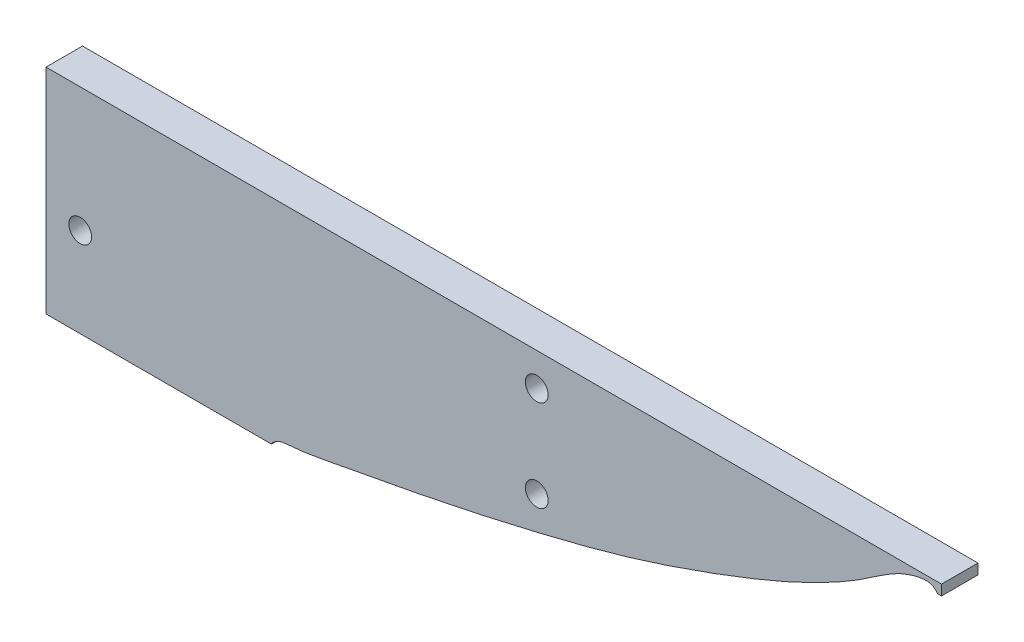
ISO-10303-21;
HEADER;
FILE_DESCRIPTION(('STEP AP214'),'2;1');
FILE_NAME('part.step','',(''),(''),'','','');
FILE_SCHEMA(('AUTOMOTIVE_DESIGN { 1 0 10303 214 1 1 1 1 }'));
ENDSEC;
DATA;
#1=APPLICATION_CONTEXT('core data for automotive mechanical design processes');
#2=APPLICATION_PROTOCOL_DEFINITION('international standard','automotive_design',2000,#1);
#3=PRODUCT_CONTEXT('',#1,'mechanical');
#4=PRODUCT('Part','Part','',(#3));
#5=PRODUCT_RELATED_PRODUCT_CATEGORY('part','',(#4));
#6=PRODUCT_DEFINITION_FORMATION('','',#4);
#7=PRODUCT_DEFINITION_CONTEXT('part definition',#1,'design');
#8=PRODUCT_DEFINITION('design','',#6,#7);
#9=PRODUCT_DEFINITION_SHAPE('','',#8);
#10=(LENGTH_UNIT() NAMED_UNIT(*) SI_UNIT(.MILLI.,.METRE.));
#11=(NAMED_UNIT(*) PLANE_ANGLE_UNIT() SI_UNIT($,.RADIAN.));
#12=(NAMED_UNIT(*) SI_UNIT($,.STERADIAN.) SOLID_ANGLE_UNIT());
#13=UNCERTAINTY_MEASURE_WITH_UNIT(LENGTH_MEASURE(1.E-05),#10,'distance_accuracy_value','');
#14=(GEOMETRIC_REPRESENTATION_CONTEXT(3) GLOBAL_UNCERTAINTY_ASSIGNED_CONTEXT((#13)) GLOBAL_UNIT_ASSIGNED_CONTEXT((#10,
#11,#12)) REPRESENTATION_CONTEXT('',''));
#15=CARTESIAN_POINT('',(0.,0.,0.));
#16=DIRECTION('',(0.,0.,1.));
#17=DIRECTION('',(1.,0.,0.));
#18=AXIS2_PLACEMENT_3D('',#15,#16,#17);
#19=CARTESIAN_POINT('',(-82.7876633942159,-44.6088772836882,284.));
#20=DIRECTION('',(0.,0.,-1.));
#21=DIRECTION('',(-1.,0.,0.));
#22=AXIS2_PLACEMENT_3D('',#19,#20,#21);
#23=PLANE('',#22);
#24=CARTESIAN_POINT('',(0.0705666698621599,-25.,284.));
#25=DIRECTION('',(0.,0.,-1.));
#26=DIRECTION('',(-1.,0.,0.));
#27=AXIS2_PLACEMENT_3D('',#24,#25,#26);
#28=CIRCLE('',#27,2.5);
#29=CARTESIAN_POINT('',(-2.42943333013784,-25.,284.));
#30=VERTEX_POINT('',#29);
#31=EDGE_CURVE('E203',#30,#30,#28,.F.);
#32=ORIENTED_EDGE('',*,*,#31,.F.);
#33=EDGE_LOOP('',(#32));
#34=FACE_BOUND('',#33,.T.);
#35=CARTESIAN_POINT('',(-58.0795296177127,-44.6040399462207,284.));
#36=CARTESIAN_POINT('',(-74.5516186288167,-44.6079999232781,284.));
#37=CARTESIAN_POINT('',(-91.0237080512297,-44.610448965777,284.));
#38=CARTESIAN_POINT('',(-107.495797495875,-44.6116316561197,284.));
#39=B_SPLINE_CURVE_WITH_KNOTS('',3,(#35,#36,#37,#38),.UNSPECIFIED.,.F.,.F.,(4,4),(0.,1.),.UNSPECIFIED.);
#40=CARTESIAN_POINT('',(-107.495797495875,-44.6116316561197,284.));
#41=VERTEX_POINT('',#40);
#42=CARTESIAN_POINT('',(-58.0795296177127,-44.6040399462207,284.));
#43=VERTEX_POINT('',#42);
#44=EDGE_CURVE('E161',#41,#43,#39,.F.);
#45=ORIENTED_EDGE('',*,*,#44,.T.);
#46=CARTESIAN_POINT('',(87.9000017033141,0.,284.));
#47=CARTESIAN_POINT('',(87.8653396456168,0.0980420146057537,284.));
#48=CARTESIAN_POINT('',(87.8013360951465,0.180749488858223,284.));
#49=CARTESIAN_POINT('',(87.6539385927667,0.325247470205002,284.));
#50=CARTESIAN_POINT('',(87.5738090656199,0.389702497273984,284.));
#51=CARTESIAN_POINT('',(87.3342367163133,0.58405683445658,284.));
#52=CARTESIAN_POINT('',(87.1783876782537,0.718628240588058,284.));
#53=CARTESIAN_POINT('',(86.8410216039408,0.955370913939716,284.));
#54=CARTESIAN_POINT('',(86.6635800893692,1.0560221129167,284.));
#55=CARTESIAN_POINT('',(86.37285087761,1.15729511730315,284.));
#56=CARTESIAN_POINT('',(86.2720949676005,1.18393050256648,284.));
#57=CARTESIAN_POINT('',(86.0710092920115,1.22407658913271,284.));
#58=CARTESIAN_POINT('',(85.9698567197867,1.23794936499142,284.));
#59=CARTESIAN_POINT('',(85.6650858045129,1.26621403875901,284.));
#60=CARTESIAN_POINT('',(85.4596028389862,1.2677819749991,284.));
#61=CARTESIAN_POINT('',(85.0494430044638,1.2517369480443,284.));
#62=CARTESIAN_POINT('',(84.8461201501977,1.2350187843396,284.));
#63=CARTESIAN_POINT('',(84.2405113190443,1.16328811663435,284.));
#64=CARTESIAN_POINT('',(83.8427672151223,1.08579802429941,284.));
#65=CARTESIAN_POINT('',(82.6580341722722,0.811265129231248,284.));
#66=CARTESIAN_POINT('',(81.8756082493053,0.568779857606499,284.));
#67=CARTESIAN_POINT('',(80.3572605425836,0.00398704805900235,284.));
#68=CARTESIAN_POINT('',(79.6206391362531,-0.32050268834254,284.));
#69=CARTESIAN_POINT('',(77.4768003054753,-1.41720591105438,284.));
#70=CARTESIAN_POINT('',(76.1325248617917,-2.30689834171348,284.));
#71=CARTESIAN_POINT('',(74.1320080138409,-3.67110689298696,284.));
#72=CARTESIAN_POINT('',(73.4673471342155,-4.1298059051442,284.));
#73=CARTESIAN_POINT('',(72.1290993022945,-5.03135336637141,284.));
#74=CARTESIAN_POINT('',(71.4565589382907,-5.47610171556373,284.));
#75=CARTESIAN_POINT('',(69.4198716178133,-6.7767208167424,284.));
#76=CARTESIAN_POINT('',(68.0357367118317,-7.59734003904331,284.));
#77=CARTESIAN_POINT('',(65.231360643593,-9.17490007759232,284.));
#78=CARTESIAN_POINT('',(63.8115567286702,-9.93261204034462,284.));
#79=CARTESIAN_POINT('',(60.9462699024224,-11.4027474832257,284.));
#80=CARTESIAN_POINT('',(59.5004015377221,-12.1144911627031,284.));
#81=CARTESIAN_POINT('',(56.581315867318,-13.4897448594068,284.));
#82=CARTESIAN_POINT('',(55.1100377877348,-14.1533176349048,284.));
#83=CARTESIAN_POINT('',(50.6733914171074,-16.0873618570717,284.));
#84=CARTESIAN_POINT('',(47.6835129425326,-17.304210263155,284.));
#85=CARTESIAN_POINT('',(41.6704256877051,-19.6485592866037,284.));
#86=CARTESIAN_POINT('',(38.6453984391489,-20.7746726471934,284.));
#87=CARTESIAN_POINT('',(32.5689267201794,-22.9464414317067,284.));
#88=CARTESIAN_POINT('',(29.5175776769437,-23.9935782128785,284.));
#89=CARTESIAN_POINT('',(23.3808508667117,-25.9873016892159,284.));
#90=CARTESIAN_POINT('',(20.293107036825,-26.9303385518061,284.));
#91=CARTESIAN_POINT('',(14.0887992538718,-28.7050622369073,284.));
#92=CARTESIAN_POINT('',(10.9718411628047,-29.5372724999855,284.));
#93=CARTESIAN_POINT('',(4.71872414116276,-31.1301622000698,284.));
#94=CARTESIAN_POINT('',(1.58334207512824,-31.8947761325704,284.));
#95=CARTESIAN_POINT('',(-4.69597160889511,-33.3844274222877,284.));
#96=CARTESIAN_POINT('',(-7.84053695370099,-34.1077207871548,284.));
#97=CARTESIAN_POINT('',(-14.1409776624989,-35.5046935082924,284.));
#98=CARTESIAN_POINT('',(-17.2974993980452,-36.1763651395498,284.));
#99=CARTESIAN_POINT('',(-23.6206088278389,-37.469490396936,284.));
#100=CARTESIAN_POINT('',(-26.7870806280639,-38.0920825005276,284.));
#101=CARTESIAN_POINT('',(-33.1254643418734,-39.3088099977398,284.));
#102=CARTESIAN_POINT('',(-36.2966345350404,-39.9068481571162,284.));
#103=CARTESIAN_POINT('',(-41.0542778663929,-40.7990932571252,284.));
#104=CARTESIAN_POINT('',(-42.6403540163524,-41.0954731164181,284.));
#105=CARTESIAN_POINT('',(-45.0207896763988,-41.5328228684628,284.));
#106=CARTESIAN_POINT('',(-45.814490562067,-41.6773941740286,284.));
#107=CARTESIAN_POINT('',(-47.4022620668679,-41.9645213486842,284.));
#108=CARTESIAN_POINT('',(-48.1960149436946,-42.109368534003,284.));
#109=CARTESIAN_POINT('',(-49.7858847036802,-42.3830667315219,284.));
#110=CARTESIAN_POINT('',(-50.5823502077406,-42.5093769811104,284.));
#111=CARTESIAN_POINT('',(-51.7824329729814,-42.661768242393,284.));
#112=CARTESIAN_POINT('',(-52.1833244113323,-42.7066174390891,284.));
#113=CARTESIAN_POINT('',(-52.9869873438325,-42.7833710311323,284.));
#114=CARTESIAN_POINT('',(-53.3897815505694,-42.8126686266408,284.));
#115=CARTESIAN_POINT('',(-54.1956202808017,-42.8686694744698,284.));
#116=CARTESIAN_POINT('',(-54.5983619798629,-42.8983799966415,284.));
#117=CARTESIAN_POINT('',(-55.1995254941832,-42.9713312718108,284.));
#118=CARTESIAN_POINT('',(-55.3994368528231,-43.0002346459609,284.));
#119=CARTESIAN_POINT('',(-55.7976837032305,-43.0732096670732,284.));
#120=CARTESIAN_POINT('',(-55.9963423349914,-43.1178965510267,284.));
#121=CARTESIAN_POINT('',(-56.3824699494814,-43.23302603243,284.));
#122=CARTESIAN_POINT('',(-56.5706730400703,-43.3035754110954,284.));
#123=CARTESIAN_POINT('',(-56.9324580496833,-43.4837323223588,284.));
#124=CARTESIAN_POINT('',(-57.1047980914133,-43.5967124128002,284.));
#125=CARTESIAN_POINT('',(-57.4252865505525,-43.8442018881937,284.));
#126=CARTESIAN_POINT('',(-57.5745982079202,-43.9810078632689,284.));
#127=CARTESIAN_POINT('',(-57.7960560746601,-44.1892150895068,284.));
#128=CARTESIAN_POINT('',(-57.8693222732054,-44.2605899168848,284.));
#129=CARTESIAN_POINT('',(-57.9666950528076,-44.3777989701655,284.));
#130=CARTESIAN_POINT('',(-57.9965401336716,-44.4186921055329,284.));
#131=CARTESIAN_POINT('',(-58.0467868509809,-44.5070696016433,284.));
#132=CARTESIAN_POINT('',(-58.0670133466572,-44.5549883260214,284.));
#133=CARTESIAN_POINT('',(-58.0795296177127,-44.6040399462207,284.));
#134=B_SPLINE_CURVE_WITH_KNOTS('',3,(#46,#47,#48,#49,#50,#51,#52,#53,#54,#55,#56,#57,#58,#59,
#60,#61,#62,#63,#64,#65,#66,#67,#68,#69,#70,#71,#72,#73,#74,#75,#76,#77,#78,#79,#80,#81,#82,#83,
#84,#85,#86,#87,#88,#89,#90,#91,#92,#93,#94,#95,#96,#97,#98,#99,#100,#101,#102,#103,#104,#105,
#106,#107,#108,#109,#110,#111,#112,#113,#114,#115,#116,#117,#118,#119,#120,#121,#122,#123,#124,
#125,#126,#127,#128,#129,#130,#131,#132,#133),.UNSPECIFIED.,.F.,.F.,(4,2,2,2,2,2,2,2,2,2,2,2,2,
2,2,2,2,2,2,2,2,2,2,2,2,2,2,2,2,2,2,2,2,2,2,2,2,2,2,2,2,2,2,4),(0.,0.00195312499999989,
0.00390624999999967,0.00781249999999911,0.0117187499999986,0.0136718749999984,
0.0156249999999983,0.0195312499999983,0.0234374999999982,0.0312499999999982,0.0468749999999981,
0.0624999999999981,0.0937499999999979,0.109374999999998,0.124999999999998,0.156249999999998,
0.187499999999998,0.218749999999998,0.249999999999998,0.312499999999998,0.374999999999998,
0.437499999999999,0.499999999999999,0.562499999999999,0.624999999999999,0.687499999999999,
0.749999999999999,0.8125,0.875,0.90625,0.921875,0.9375,0.953125,0.9609375,0.96875,0.9765625,
0.98046875,0.984375,0.98828125,0.9921875,0.99609375,0.998046875,0.9990234375,1.),.UNSPECIFIED.);
#135=CARTESIAN_POINT('',(87.9000017033141,0.,284.));
#136=VERTEX_POINT('',#135);
#137=EDGE_CURVE('E88',#43,#136,#134,.F.);
#138=ORIENTED_EDGE('',*,*,#137,.T.);
#139=DIRECTION('',(1.,0.,0.));
#140=VECTOR('',#139,1.);
#141=CARTESIAN_POINT('',(87.9000017033141,0.,284.));
#142=LINE('',#141,#140);
#143=CARTESIAN_POINT('',(88.7801731012481,0.,284.));
#144=VERTEX_POINT('',#143);
#145=EDGE_CURVE('E102',#136,#144,#142,.T.);
#146=ORIENTED_EDGE('',*,*,#145,.T.);
#147=DIRECTION('',(0.,1.,0.));
#148=VECTOR('',#147,1.);
#149=CARTESIAN_POINT('',(88.7801731012481,2.25600000000004,284.));
#150=LINE('',#149,#148);
#151=CARTESIAN_POINT('',(88.7801731012481,2.25600000000004,284.));
#152=VERTEX_POINT('',#151);
#153=EDGE_CURVE('E96',#144,#152,#150,.T.);
#154=ORIENTED_EDGE('',*,*,#153,.T.);
#155=DIRECTION('',(-1.,0.,0.));
#156=VECTOR('',#155,1.);
#157=CARTESIAN_POINT('',(88.7801731012481,2.25600000000004,284.));
#158=LINE('',#157,#156);
#159=CARTESIAN_POINT('',(-107.495797495875,2.25600000000002,284.));
#160=VERTEX_POINT('',#159);
#161=EDGE_CURVE('E100',#152,#160,#158,.T.);
#162=ORIENTED_EDGE('',*,*,#161,.T.);
#163=DIRECTION('',(0.,-1.,0.));
#164=VECTOR('',#163,1.);
#165=CARTESIAN_POINT('',(-107.495797495875,-44.6116316561197,284.));
#166=LINE('',#165,#164);
#167=EDGE_CURVE('E51',#160,#41,#166,.T.);
#168=ORIENTED_EDGE('',*,*,#167,.T.);
#169=EDGE_LOOP('',(#45,#138,#146,#154,#162,#168));
#170=FACE_BOUND('',#169,.T.);
#171=CARTESIAN_POINT('',(0.0705666698621599,-4.96037406111782,284.));
#172=DIRECTION('',(0.,0.,-1.));
#173=DIRECTION('',(-1.,0.,0.));
#174=AXIS2_PLACEMENT_3D('',#171,#172,#173);
#175=CIRCLE('',#174,2.5);
#176=CARTESIAN_POINT('',(-2.42943333013784,-4.96037406111782,284.));
#177=VERTEX_POINT('',#176);
#178=EDGE_CURVE('E202',#177,#177,#175,.F.);
#179=ORIENTED_EDGE('',*,*,#178,.F.);
#180=EDGE_LOOP('',(#179));
#181=FACE_BOUND('',#180,.T.);
#182=CARTESIAN_POINT('',(-100.,-25.,284.));
#183=DIRECTION('',(0.,0.,-1.));
#184=DIRECTION('',(-1.,0.,0.));
#185=AXIS2_PLACEMENT_3D('',#182,#183,#184);
#186=CIRCLE('',#185,2.5);
#187=CARTESIAN_POINT('',(-102.5,-25.,284.));
#188=VERTEX_POINT('',#187);
#189=EDGE_CURVE('E206',#188,#188,#186,.F.);
#190=ORIENTED_EDGE('',*,*,#189,.F.);
#191=EDGE_LOOP('',(#190));
#192=FACE_BOUND('',#191,.T.);
#193=ADVANCED_FACE('F30',(#34,#170,#181,#192),#23,.F.);
#194=CARTESIAN_POINT('',(-82.7876633942159,-44.6088772836882,276.));
#195=DIRECTION('',(0.,0.,-1.));
#196=DIRECTION('',(-1.,0.,0.));
#197=AXIS2_PLACEMENT_3D('',#194,#195,#196);
#198=PLANE('',#197);
#199=CARTESIAN_POINT('',(0.0705666698621599,-25.,276.));
#200=DIRECTION('',(0.,0.,-1.));
#201=DIRECTION('',(-1.,0.,0.));
#202=AXIS2_PLACEMENT_3D('',#199,#200,#201);
#203=CIRCLE('',#202,2.5);
#204=CARTESIAN_POINT('',(-2.42943333013784,-25.,276.));
#205=VERTEX_POINT('',#204);
#206=EDGE_CURVE('E204',#205,#205,#203,.F.);
#207=ORIENTED_EDGE('',*,*,#206,.T.);
#208=EDGE_LOOP('',(#207));
#209=FACE_BOUND('',#208,.T.);
#210=CARTESIAN_POINT('',(-107.495797495875,-44.6116316561197,276.));
#211=CARTESIAN_POINT('',(-91.0237080512297,-44.610448965777,276.));
#212=CARTESIAN_POINT('',(-74.5516186288167,-44.6079999232781,276.));
#213=CARTESIAN_POINT('',(-58.0795296177127,-44.6040399462207,276.));
#214=B_SPLINE_CURVE_WITH_KNOTS('',3,(#210,#211,#212,#213),.UNSPECIFIED.,.F.,.F.,(4,4),(0.,1.),.UNSPECIFIED.);
#215=CARTESIAN_POINT('',(-107.495797495875,-44.6116316561197,276.));
#216=VERTEX_POINT('',#215);
#217=CARTESIAN_POINT('',(-58.0795296177127,-44.6040399462207,276.));
#218=VERTEX_POINT('',#217);
#219=EDGE_CURVE('E178',#216,#218,#214,.T.);
#220=ORIENTED_EDGE('',*,*,#219,.F.);
#221=DIRECTION('',(0.,-1.,0.));
#222=VECTOR('',#221,1.);
#223=CARTESIAN_POINT('',(-107.495797495875,-44.6116316561197,276.));
#224=LINE('',#223,#222);
#225=CARTESIAN_POINT('',(-107.495797495875,2.25600000000002,276.));
#226=VERTEX_POINT('',#225);
#227=EDGE_CURVE('E80',#226,#216,#224,.T.);
#228=ORIENTED_EDGE('',*,*,#227,.F.);
#229=DIRECTION('',(-1.,0.,0.));
#230=VECTOR('',#229,1.);
#231=CARTESIAN_POINT('',(88.7801731012481,2.25600000000004,276.));
#232=LINE('',#231,#230);
#233=CARTESIAN_POINT('',(88.7801731012481,2.25600000000004,276.));
#234=VERTEX_POINT('',#233);
#235=EDGE_CURVE('E74',#234,#226,#232,.T.);
#236=ORIENTED_EDGE('',*,*,#235,.F.);
#237=DIRECTION('',(0.,1.,0.));
#238=VECTOR('',#237,1.);
#239=CARTESIAN_POINT('',(88.7801731012481,2.25600000000004,276.));
#240=LINE('',#239,#238);
#241=CARTESIAN_POINT('',(88.7801731012481,0.,276.));
#242=VERTEX_POINT('',#241);
#243=EDGE_CURVE('E110',#242,#234,#240,.T.);
#244=ORIENTED_EDGE('',*,*,#243,.F.);
#245=DIRECTION('',(1.,0.,0.));
#246=VECTOR('',#245,1.);
#247=CARTESIAN_POINT('',(87.9000017033141,0.,276.));
#248=LINE('',#247,#246);
#249=CARTESIAN_POINT('',(87.9000017033141,0.,276.));
#250=VERTEX_POINT('',#249);
#251=EDGE_CURVE('E121',#250,#242,#248,.T.);
#252=ORIENTED_EDGE('',*,*,#251,.F.);
#253=CARTESIAN_POINT('',(-58.0795296177127,-44.6040399462207,276.));
#254=CARTESIAN_POINT('',(-58.0670133466572,-44.5549883260214,276.));
#255=CARTESIAN_POINT('',(-58.0467868509809,-44.5070696016433,276.));
#256=CARTESIAN_POINT('',(-57.9965401336716,-44.4186921055329,276.));
#257=CARTESIAN_POINT('',(-57.9666950528076,-44.3777989701655,276.));
#258=CARTESIAN_POINT('',(-57.8693222732054,-44.2605899168848,276.));
#259=CARTESIAN_POINT('',(-57.7960560746601,-44.1892150895068,276.));
#260=CARTESIAN_POINT('',(-57.5745982079202,-43.9810078632689,276.));
#261=CARTESIAN_POINT('',(-57.4252865505525,-43.8442018881937,276.));
#262=CARTESIAN_POINT('',(-57.1047980914133,-43.5967124128002,276.));
#263=CARTESIAN_POINT('',(-56.9324580496833,-43.4837323223588,276.));
#264=CARTESIAN_POINT('',(-56.5706730400703,-43.3035754110954,276.));
#265=CARTESIAN_POINT('',(-56.3824699494814,-43.23302603243,276.));
#266=CARTESIAN_POINT('',(-55.9963423349914,-43.1178965510267,276.));
#267=CARTESIAN_POINT('',(-55.7976837032305,-43.0732096670732,276.));
#268=CARTESIAN_POINT('',(-55.3994368528231,-43.0002346459609,276.));
#269=CARTESIAN_POINT('',(-55.1995254941832,-42.9713312718108,276.));
#270=CARTESIAN_POINT('',(-54.5983619798629,-42.8983799966415,276.));
#271=CARTESIAN_POINT('',(-54.1956202808017,-42.8686694744698,276.));
#272=CARTESIAN_POINT('',(-53.3897815505694,-42.8126686266408,276.));
#273=CARTESIAN_POINT('',(-52.9869873438325,-42.7833710311323,276.));
#274=CARTESIAN_POINT('',(-52.1833244113323,-42.7066174390891,276.));
#275=CARTESIAN_POINT('',(-51.7824329729814,-42.661768242393,276.));
#276=CARTESIAN_POINT('',(-50.5823502077406,-42.5093769811104,276.));
#277=CARTESIAN_POINT('',(-49.7858847036802,-42.3830667315219,276.));
#278=CARTESIAN_POINT('',(-48.1960149436946,-42.109368534003,276.));
#279=CARTESIAN_POINT('',(-47.4022620668679,-41.9645213486842,276.));
#280=CARTESIAN_POINT('',(-45.814490562067,-41.6773941740286,276.));
#281=CARTESIAN_POINT('',(-45.0207896763988,-41.5328228684628,276.));
#282=CARTESIAN_POINT('',(-42.6403540163524,-41.0954731164181,276.));
#283=CARTESIAN_POINT('',(-41.0542778663929,-40.7990932571252,276.));
#284=CARTESIAN_POINT('',(-36.2966345350404,-39.9068481571162,276.));
#285=CARTESIAN_POINT('',(-33.1254643418734,-39.3088099977398,276.));
#286=CARTESIAN_POINT('',(-26.7870806280639,-38.0920825005276,276.));
#287=CARTESIAN_POINT('',(-23.6206088278389,-37.469490396936,276.));
#288=CARTESIAN_POINT('',(-17.2974993980452,-36.1763651395498,276.));
#289=CARTESIAN_POINT('',(-14.1409776624989,-35.5046935082924,276.));
#290=CARTESIAN_POINT('',(-7.84053695370099,-34.1077207871548,276.));
#291=CARTESIAN_POINT('',(-4.69597160889511,-33.3844274222877,276.));
#292=CARTESIAN_POINT('',(1.58334207512824,-31.8947761325704,276.));
#293=CARTESIAN_POINT('',(4.71872414116276,-31.1301622000698,276.));
#294=CARTESIAN_POINT('',(10.9718411628047,-29.5372724999855,276.));
#295=CARTESIAN_POINT('',(14.0887992538718,-28.7050622369073,276.));
#296=CARTESIAN_POINT('',(20.293107036825,-26.9303385518061,276.));
#297=CARTESIAN_POINT('',(23.3808508667117,-25.9873016892159,276.));
#298=CARTESIAN_POINT('',(29.5175776769437,-23.9935782128785,276.));
#299=CARTESIAN_POINT('',(32.5689267201794,-22.9464414317067,276.));
#300=CARTESIAN_POINT('',(38.6453984391489,-20.7746726471934,276.));
#301=CARTESIAN_POINT('',(41.6704256877051,-19.6485592866037,276.));
#302=CARTESIAN_POINT('',(47.6835129425326,-17.304210263155,276.));
#303=CARTESIAN_POINT('',(50.6733914171074,-16.0873618570717,276.));
#304=CARTESIAN_POINT('',(55.1100377877348,-14.1533176349048,276.));
#305=CARTESIAN_POINT('',(56.581315867318,-13.4897448594068,276.));
#306=CARTESIAN_POINT('',(59.5004015377221,-12.1144911627031,276.));
#307=CARTESIAN_POINT('',(60.9462699024224,-11.4027474832257,276.));
#308=CARTESIAN_POINT('',(63.8115567286702,-9.93261204034462,276.));
#309=CARTESIAN_POINT('',(65.231360643593,-9.17490007759232,276.));
#310=CARTESIAN_POINT('',(68.0357367118317,-7.59734003904331,276.));
#311=CARTESIAN_POINT('',(69.4198716178133,-6.7767208167424,276.));
#312=CARTESIAN_POINT('',(71.4565589382907,-5.47610171556373,276.));
#313=CARTESIAN_POINT('',(72.1290993022945,-5.03135336637141,276.));
#314=CARTESIAN_POINT('',(73.4673471342155,-4.1298059051442,276.));
#315=CARTESIAN_POINT('',(74.1320080138409,-3.67110689298696,276.));
#316=CARTESIAN_POINT('',(76.1325248617917,-2.30689834171348,276.));
#317=CARTESIAN_POINT('',(77.4768003054753,-1.41720591105438,276.));
#318=CARTESIAN_POINT('',(79.6206391362531,-0.32050268834254,276.));
#319=CARTESIAN_POINT('',(80.3572605425836,0.00398704805900235,276.));
#320=CARTESIAN_POINT('',(81.8756082493053,0.568779857606499,276.));
#321=CARTESIAN_POINT('',(82.6580341722722,0.811265129231248,276.));
#322=CARTESIAN_POINT('',(83.8427672151223,1.08579802429941,276.));
#323=CARTESIAN_POINT('',(84.2405113190443,1.16328811663435,276.));
#324=CARTESIAN_POINT('',(84.8461201501977,1.2350187843396,276.));
#325=CARTESIAN_POINT('',(85.0494430044638,1.2517369480443,276.));
#326=CARTESIAN_POINT('',(85.4596028389862,1.2677819749991,276.));
#327=CARTESIAN_POINT('',(85.6650858045129,1.26621403875901,276.));
#328=CARTESIAN_POINT('',(85.9698567197867,1.23794936499142,276.));
#329=CARTESIAN_POINT('',(86.0710092920115,1.22407658913271,276.));
#330=CARTESIAN_POINT('',(86.2720949676005,1.18393050256648,276.));
#331=CARTESIAN_POINT('',(86.37285087761,1.15729511730315,276.));
#332=CARTESIAN_POINT('',(86.6635800893692,1.0560221129167,276.));
#333=CARTESIAN_POINT('',(86.8410216039408,0.955370913939716,276.));
#334=CARTESIAN_POINT('',(87.1783876782537,0.718628240588058,276.));
#335=CARTESIAN_POINT('',(87.3342367163133,0.58405683445658,276.));
#336=CARTESIAN_POINT('',(87.5738090656199,0.389702497273984,276.));
#337=CARTESIAN_POINT('',(87.6539385927667,0.325247470205002,276.));
#338=CARTESIAN_POINT('',(87.8013360951465,0.180749488858223,276.));
#339=CARTESIAN_POINT('',(87.8653396456168,0.0980420146057537,276.));
#340=CARTESIAN_POINT('',(87.9000017033141,0.,276.));
#341=B_SPLINE_CURVE_WITH_KNOTS('',3,(#253,#254,#255,#256,#257,#258,#259,#260,#261,#262,#263,
#264,#265,#266,#267,#268,#269,#270,#271,#272,#273,#274,#275,#276,#277,#278,#279,#280,#281,#282,
#283,#284,#285,#286,#287,#288,#289,#290,#291,#292,#293,#294,#295,#296,#297,#298,#299,#300,#301,
#302,#303,#304,#305,#306,#307,#308,#309,#310,#311,#312,#313,#314,#315,#316,#317,#318,#319,#320,
#321,#322,#323,#324,#325,#326,#327,#328,#329,#330,#331,#332,#333,#334,#335,#336,#337,#338,#339,
#340),.UNSPECIFIED.,.F.,.F.,(4,2,2,2,2,2,2,2,2,2,2,2,2,2,2,2,2,2,2,2,2,2,2,2,2,2,2,2,2,2,2,2,2,
2,2,2,2,2,2,2,2,2,2,4),(0.,0.000976562499999889,0.001953125,0.00390625,0.0078125,0.01171875,
0.015625,0.01953125,0.0234375,0.03125,0.0390625,0.046875,0.0625,0.0781250000000001,
0.0937500000000001,0.125,0.1875,0.250000000000001,0.312500000000001,0.375000000000001,
0.437500000000001,0.500000000000001,0.562500000000001,0.625000000000002,0.687500000000002,
0.750000000000002,0.781250000000002,0.812500000000002,0.843750000000002,0.875000000000002,
0.890625000000002,0.906250000000002,0.937500000000002,0.953125000000002,0.968750000000002,
0.976562500000002,0.980468750000002,0.984375000000002,0.986328125000002,0.988281250000001,
0.992187500000001,0.99609375,0.998046875,1.),.UNSPECIFIED.);
#342=EDGE_CURVE('E252',#218,#250,#341,.T.);
#343=ORIENTED_EDGE('',*,*,#342,.F.);
#344=EDGE_LOOP('',(#220,#228,#236,#244,#252,#343));
#345=FACE_BOUND('',#344,.T.);
#346=CARTESIAN_POINT('',(0.0705666698621599,-4.96037406111782,276.));
#347=DIRECTION('',(0.,0.,-1.));
#348=DIRECTION('',(-1.,0.,0.));
#349=AXIS2_PLACEMENT_3D('',#346,#347,#348);
#350=CIRCLE('',#349,2.5);
#351=CARTESIAN_POINT('',(-2.42943333013784,-4.96037406111782,276.));
#352=VERTEX_POINT('',#351);
#353=EDGE_CURVE('E200',#352,#352,#350,.F.);
#354=ORIENTED_EDGE('',*,*,#353,.T.);
#355=EDGE_LOOP('',(#354));
#356=FACE_BOUND('',#355,.T.);
#357=CARTESIAN_POINT('',(-100.,-25.,276.));
#358=DIRECTION('',(0.,0.,-1.));
#359=DIRECTION('',(-1.,0.,0.));
#360=AXIS2_PLACEMENT_3D('',#357,#358,#359);
#361=CIRCLE('',#360,2.5);
#362=CARTESIAN_POINT('',(-102.5,-25.,276.));
#363=VERTEX_POINT('',#362);
#364=EDGE_CURVE('E36',#363,#363,#361,.F.);
#365=ORIENTED_EDGE('',*,*,#364,.T.);
#366=EDGE_LOOP('',(#365));
#367=FACE_BOUND('',#366,.T.);
#368=ADVANCED_FACE('F139',(#209,#345,#356,#367),#198,.T.);
#369=CARTESIAN_POINT('',(-107.495797495875,-44.6116316561197,284.));
#370=CARTESIAN_POINT('',(-91.0237080512297,-44.610448965777,284.));
#371=CARTESIAN_POINT('',(-74.5516186288167,-44.6079999232781,284.));
#372=CARTESIAN_POINT('',(-58.0795296177127,-44.6040399462207,284.));
#373=B_SPLINE_CURVE_WITH_KNOTS('',3,(#369,#370,#371,#372),.UNSPECIFIED.,.F.,.F.,(4,4),(0.,1.),.UNSPECIFIED.);
#374=DIRECTION('',(0.,0.,-1.));
#375=VECTOR('',#374,1.);
#376=SURFACE_OF_LINEAR_EXTRUSION('',#373,#375);
#377=ORIENTED_EDGE('',*,*,#219,.T.);
#378=DIRECTION('',(0.,0.,-1.));
#379=VECTOR('',#378,1.);
#380=CARTESIAN_POINT('',(-58.0795296177127,-44.6040399462207,284.));
#381=LINE('',#380,#379);
#382=EDGE_CURVE('E11',#43,#218,#381,.T.);
#383=ORIENTED_EDGE('',*,*,#382,.F.);
#384=ORIENTED_EDGE('',*,*,#44,.F.);
#385=DIRECTION('',(0.,0.,-1.));
#386=VECTOR('',#385,1.);
#387=CARTESIAN_POINT('',(-107.495797495875,-44.6116316561197,284.));
#388=LINE('',#387,#386);
#389=EDGE_CURVE('E116',#41,#216,#388,.T.);
#390=ORIENTED_EDGE('',*,*,#389,.T.);
#391=EDGE_LOOP('',(#377,#383,#384,#390));
#392=FACE_BOUND('',#391,.T.);
#393=ADVANCED_FACE('F32',(#392),#376,.F.);
#394=CARTESIAN_POINT('',(-58.0795296177127,-44.6040399462207,284.));
#395=CARTESIAN_POINT('',(-58.0670133466572,-44.5549883260214,284.));
#396=CARTESIAN_POINT('',(-58.0467868509809,-44.5070696016433,284.));
#397=CARTESIAN_POINT('',(-57.9965401336716,-44.4186921055329,284.));
#398=CARTESIAN_POINT('',(-57.9666950528076,-44.3777989701655,284.));
#399=CARTESIAN_POINT('',(-57.8693222732054,-44.2605899168848,284.));
#400=CARTESIAN_POINT('',(-57.7960560746601,-44.1892150895068,284.));
#401=CARTESIAN_POINT('',(-57.5745982079202,-43.9810078632689,284.));
#402=CARTESIAN_POINT('',(-57.4252865505525,-43.8442018881937,284.));
#403=CARTESIAN_POINT('',(-57.1047980914133,-43.5967124128002,284.));
#404=CARTESIAN_POINT('',(-56.9324580496833,-43.4837323223588,284.));
#405=CARTESIAN_POINT('',(-56.5706730400703,-43.3035754110954,284.));
#406=CARTESIAN_POINT('',(-56.3824699494814,-43.23302603243,284.));
#407=CARTESIAN_POINT('',(-55.9963423349914,-43.1178965510267,284.));
#408=CARTESIAN_POINT('',(-55.7976837032305,-43.0732096670732,284.));
#409=CARTESIAN_POINT('',(-55.3994368528231,-43.0002346459609,284.));
#410=CARTESIAN_POINT('',(-55.1995254941832,-42.9713312718108,284.));
#411=CARTESIAN_POINT('',(-54.5983619798629,-42.8983799966415,284.));
#412=CARTESIAN_POINT('',(-54.1956202808017,-42.8686694744698,284.));
#413=CARTESIAN_POINT('',(-53.3897815505694,-42.8126686266408,284.));
#414=CARTESIAN_POINT('',(-52.9869873438325,-42.7833710311323,284.));
#415=CARTESIAN_POINT('',(-52.1833244113323,-42.7066174390891,284.));
#416=CARTESIAN_POINT('',(-51.7824329729814,-42.661768242393,284.));
#417=CARTESIAN_POINT('',(-50.5823502077406,-42.5093769811104,284.));
#418=CARTESIAN_POINT('',(-49.7858847036802,-42.3830667315219,284.));
#419=CARTESIAN_POINT('',(-48.1960149436946,-42.109368534003,284.));
#420=CARTESIAN_POINT('',(-47.4022620668679,-41.9645213486842,284.));
#421=CARTESIAN_POINT('',(-45.814490562067,-41.6773941740286,284.));
#422=CARTESIAN_POINT('',(-45.0207896763988,-41.5328228684628,284.));
#423=CARTESIAN_POINT('',(-42.6403540163524,-41.0954731164181,284.));
#424=CARTESIAN_POINT('',(-41.0542778663929,-40.7990932571252,284.));
#425=CARTESIAN_POINT('',(-36.2966345350404,-39.9068481571162,284.));
#426=CARTESIAN_POINT('',(-33.1254643418734,-39.3088099977398,284.));
#427=CARTESIAN_POINT('',(-26.7870806280639,-38.0920825005276,284.));
#428=CARTESIAN_POINT('',(-23.6206088278389,-37.469490396936,284.));
#429=CARTESIAN_POINT('',(-17.2974993980452,-36.1763651395498,284.));
#430=CARTESIAN_POINT('',(-14.1409776624989,-35.5046935082924,284.));
#431=CARTESIAN_POINT('',(-7.84053695370099,-34.1077207871548,284.));
#432=CARTESIAN_POINT('',(-4.69597160889511,-33.3844274222877,284.));
#433=CARTESIAN_POINT('',(1.58334207512824,-31.8947761325704,284.));
#434=CARTESIAN_POINT('',(4.71872414116276,-31.1301622000698,284.));
#435=CARTESIAN_POINT('',(10.9718411628047,-29.5372724999855,284.));
#436=CARTESIAN_POINT('',(14.0887992538718,-28.7050622369073,284.));
#437=CARTESIAN_POINT('',(20.293107036825,-26.9303385518061,284.));
#438=CARTESIAN_POINT('',(23.3808508667117,-25.9873016892159,284.));
#439=CARTESIAN_POINT('',(29.5175776769437,-23.9935782128785,284.));
#440=CARTESIAN_POINT('',(32.5689267201794,-22.9464414317067,284.));
#441=CARTESIAN_POINT('',(38.6453984391489,-20.7746726471934,284.));
#442=CARTESIAN_POINT('',(41.6704256877051,-19.6485592866037,284.));
#443=CARTESIAN_POINT('',(47.6835129425326,-17.304210263155,284.));
#444=CARTESIAN_POINT('',(50.6733914171074,-16.0873618570717,284.));
#445=CARTESIAN_POINT('',(55.1100377877348,-14.1533176349048,284.));
#446=CARTESIAN_POINT('',(56.581315867318,-13.4897448594068,284.));
#447=CARTESIAN_POINT('',(59.5004015377221,-12.1144911627031,284.));
#448=CARTESIAN_POINT('',(60.9462699024224,-11.4027474832257,284.));
#449=CARTESIAN_POINT('',(63.8115567286702,-9.93261204034462,284.));
#450=CARTESIAN_POINT('',(65.231360643593,-9.17490007759232,284.));
#451=CARTESIAN_POINT('',(68.0357367118317,-7.59734003904331,284.));
#452=CARTESIAN_POINT('',(69.4198716178133,-6.7767208167424,284.));
#453=CARTESIAN_POINT('',(71.4565589382907,-5.47610171556373,284.));
#454=CARTESIAN_POINT('',(72.1290993022945,-5.03135336637141,284.));
#455=CARTESIAN_POINT('',(73.4673471342155,-4.1298059051442,284.));
#456=CARTESIAN_POINT('',(74.1320080138409,-3.67110689298696,284.));
#457=CARTESIAN_POINT('',(76.1325248617917,-2.30689834171348,284.));
#458=CARTESIAN_POINT('',(77.4768003054753,-1.41720591105438,284.));
#459=CARTESIAN_POINT('',(79.6206391362531,-0.32050268834254,284.));
#460=CARTESIAN_POINT('',(80.3572605425836,0.00398704805900235,284.));
#461=CARTESIAN_POINT('',(81.8756082493053,0.568779857606499,284.));
#462=CARTESIAN_POINT('',(82.6580341722722,0.811265129231248,284.));
#463=CARTESIAN_POINT('',(83.8427672151223,1.08579802429941,284.));
#464=CARTESIAN_POINT('',(84.2405113190443,1.16328811663435,284.));
#465=CARTESIAN_POINT('',(84.8461201501977,1.2350187843396,284.));
#466=CARTESIAN_POINT('',(85.0494430044638,1.2517369480443,284.));
#467=CARTESIAN_POINT('',(85.4596028389862,1.2677819749991,284.));
#468=CARTESIAN_POINT('',(85.6650858045129,1.26621403875901,284.));
#469=CARTESIAN_POINT('',(85.9698567197867,1.23794936499142,284.));
#470=CARTESIAN_POINT('',(86.0710092920115,1.22407658913271,284.));
#471=CARTESIAN_POINT('',(86.2720949676005,1.18393050256648,284.));
#472=CARTESIAN_POINT('',(86.37285087761,1.15729511730315,284.));
#473=CARTESIAN_POINT('',(86.6635800893692,1.0560221129167,284.));
#474=CARTESIAN_POINT('',(86.8410216039408,0.955370913939716,284.));
#475=CARTESIAN_POINT('',(87.1783876782537,0.718628240588058,284.));
#476=CARTESIAN_POINT('',(87.3342367163133,0.58405683445658,284.));
#477=CARTESIAN_POINT('',(87.5738090656199,0.389702497273984,284.));
#478=CARTESIAN_POINT('',(87.6539385927667,0.325247470205002,284.));
#479=CARTESIAN_POINT('',(87.8013360951465,0.180749488858223,284.));
#480=CARTESIAN_POINT('',(87.8653396456168,0.0980420146057537,284.));
#481=CARTESIAN_POINT('',(87.9000017033141,0.,284.));
#482=B_SPLINE_CURVE_WITH_KNOTS('',3,(#394,#395,#396,#397,#398,#399,#400,#401,#402,#403,#404,
#405,#406,#407,#408,#409,#410,#411,#412,#413,#414,#415,#416,#417,#418,#419,#420,#421,#422,#423,
#424,#425,#426,#427,#428,#429,#430,#431,#432,#433,#434,#435,#436,#437,#438,#439,#440,#441,#442,
#443,#444,#445,#446,#447,#448,#449,#450,#451,#452,#453,#454,#455,#456,#457,#458,#459,#460,#461,
#462,#463,#464,#465,#466,#467,#468,#469,#470,#471,#472,#473,#474,#475,#476,#477,#478,#479,#480,
#481),.UNSPECIFIED.,.F.,.F.,(4,2,2,2,2,2,2,2,2,2,2,2,2,2,2,2,2,2,2,2,2,2,2,2,2,2,2,2,2,2,2,2,2,
2,2,2,2,2,2,2,2,2,2,4),(0.,0.000976562499999889,0.001953125,0.00390625,0.0078125,0.01171875,
0.015625,0.01953125,0.0234375,0.03125,0.0390625,0.046875,0.0625,0.0781250000000001,
0.0937500000000001,0.125,0.1875,0.250000000000001,0.312500000000001,0.375000000000001,
0.437500000000001,0.500000000000001,0.562500000000001,0.625000000000002,0.687500000000002,
0.750000000000002,0.781250000000002,0.812500000000002,0.843750000000002,0.875000000000002,
0.890625000000002,0.906250000000002,0.937500000000002,0.953125000000002,0.968750000000002,
0.976562500000002,0.980468750000002,0.984375000000002,0.986328125000002,0.988281250000001,
0.992187500000001,0.99609375,0.998046875,1.),.UNSPECIFIED.);
#483=DIRECTION('',(0.,0.,-1.));
#484=VECTOR('',#483,1.);
#485=SURFACE_OF_LINEAR_EXTRUSION('',#482,#484);
#486=ORIENTED_EDGE('',*,*,#342,.T.);
#487=DIRECTION('',(0.,0.,-1.));
#488=VECTOR('',#487,1.);
#489=CARTESIAN_POINT('',(87.9000017033141,0.,284.));
#490=LINE('',#489,#488);
#491=EDGE_CURVE('E42',#136,#250,#490,.T.);
#492=ORIENTED_EDGE('',*,*,#491,.F.);
#493=ORIENTED_EDGE('',*,*,#137,.F.);
#494=ORIENTED_EDGE('',*,*,#382,.T.);
#495=EDGE_LOOP('',(#486,#492,#493,#494));
#496=FACE_BOUND('',#495,.T.);
#497=ADVANCED_FACE('F230',(#496),#485,.F.);
#498=CARTESIAN_POINT('',(87.9000017033141,0.,284.));
#499=DIRECTION('',(0.,1.,0.));
#500=DIRECTION('',(-1.,0.,0.));
#501=AXIS2_PLACEMENT_3D('',#498,#499,#500);
#502=PLANE('',#501);
#503=ORIENTED_EDGE('',*,*,#251,.T.);
#504=DIRECTION('',(0.,0.,-1.));
#505=VECTOR('',#504,1.);
#506=CARTESIAN_POINT('',(88.7801731012481,0.,284.));
#507=LINE('',#506,#505);
#508=EDGE_CURVE('E111',#144,#242,#507,.T.);
#509=ORIENTED_EDGE('',*,*,#508,.F.);
#510=ORIENTED_EDGE('',*,*,#145,.F.);
#511=ORIENTED_EDGE('',*,*,#491,.T.);
#512=EDGE_LOOP('',(#503,#509,#510,#511));
#513=FACE_BOUND('',#512,.T.);
#514=ADVANCED_FACE('F234',(#513),#502,.F.);
#515=CARTESIAN_POINT('',(88.7801731012481,2.25600000000004,284.));
#516=DIRECTION('',(-1.,0.,0.));
#517=DIRECTION('',(0.,0.,1.));
#518=AXIS2_PLACEMENT_3D('',#515,#516,#517);
#519=PLANE('',#518);
#520=ORIENTED_EDGE('',*,*,#243,.T.);
#521=DIRECTION('',(0.,0.,-1.));
#522=VECTOR('',#521,1.);
#523=CARTESIAN_POINT('',(88.7801731012481,2.25600000000004,284.));
#524=LINE('',#523,#522);
#525=EDGE_CURVE('E107',#152,#234,#524,.T.);
#526=ORIENTED_EDGE('',*,*,#525,.F.);
#527=ORIENTED_EDGE('',*,*,#153,.F.);
#528=ORIENTED_EDGE('',*,*,#508,.T.);
#529=EDGE_LOOP('',(#520,#526,#527,#528));
#530=FACE_BOUND('',#529,.T.);
#531=ADVANCED_FACE('F108',(#530),#519,.F.);
#532=CARTESIAN_POINT('',(88.7801731012481,2.25600000000004,284.));
#533=DIRECTION('',(0.,-1.,0.));
#534=DIRECTION('',(1.,0.,0.));
#535=AXIS2_PLACEMENT_3D('',#532,#533,#534);
#536=PLANE('',#535);
#537=ORIENTED_EDGE('',*,*,#235,.T.);
#538=DIRECTION('',(0.,0.,-1.));
#539=VECTOR('',#538,1.);
#540=CARTESIAN_POINT('',(-107.495797495875,2.25600000000002,284.));
#541=LINE('',#540,#539);
#542=EDGE_CURVE('E112',#160,#226,#541,.T.);
#543=ORIENTED_EDGE('',*,*,#542,.F.);
#544=ORIENTED_EDGE('',*,*,#161,.F.);
#545=ORIENTED_EDGE('',*,*,#525,.T.);
#546=EDGE_LOOP('',(#537,#543,#544,#545));
#547=FACE_BOUND('',#546,.T.);
#548=ADVANCED_FACE('F114',(#547),#536,.F.);
#549=CARTESIAN_POINT('',(-107.495797495875,-44.6116316561197,284.));
#550=DIRECTION('',(1.,0.,0.));
#551=DIRECTION('',(0.,0.,-1.));
#552=AXIS2_PLACEMENT_3D('',#549,#550,#551);
#553=PLANE('',#552);
#554=ORIENTED_EDGE('',*,*,#227,.T.);
#555=ORIENTED_EDGE('',*,*,#389,.F.);
#556=ORIENTED_EDGE('',*,*,#167,.F.);
#557=ORIENTED_EDGE('',*,*,#542,.T.);
#558=EDGE_LOOP('',(#554,#555,#556,#557));
#559=FACE_BOUND('',#558,.T.);
#560=ADVANCED_FACE('F282',(#559),#553,.F.);
#561=CARTESIAN_POINT('',(0.0705666698621599,-4.96037406111782,308.));
#562=DIRECTION('',(0.,0.,-1.));
#563=DIRECTION('',(-1.,0.,0.));
#564=AXIS2_PLACEMENT_3D('',#561,#562,#563);
#565=CYLINDRICAL_SURFACE('',#564,2.5);
#566=ORIENTED_EDGE('',*,*,#353,.F.);
#567=EDGE_LOOP('',(#566));
#568=FACE_BOUND('',#567,.T.);
#569=ORIENTED_EDGE('',*,*,#178,.T.);
#570=EDGE_LOOP('',(#569));
#571=FACE_BOUND('',#570,.T.);
#572=ADVANCED_FACE('F141',(#568,#571),#565,.F.);
#573=CARTESIAN_POINT('',(0.0705666698621599,-25.,308.));
#574=DIRECTION('',(0.,0.,-1.));
#575=DIRECTION('',(-1.,0.,0.));
#576=AXIS2_PLACEMENT_3D('',#573,#574,#575);
#577=CYLINDRICAL_SURFACE('',#576,2.5);
#578=ORIENTED_EDGE('',*,*,#206,.F.);
#579=EDGE_LOOP('',(#578));
#580=FACE_BOUND('',#579,.T.);
#581=ORIENTED_EDGE('',*,*,#31,.T.);
#582=EDGE_LOOP('',(#581));
#583=FACE_BOUND('',#582,.T.);
#584=ADVANCED_FACE('F273',(#580,#583),#577,.F.);
#585=CARTESIAN_POINT('',(-100.,-25.,308.));
#586=DIRECTION('',(0.,0.,-1.));
#587=DIRECTION('',(-1.,0.,0.));
#588=AXIS2_PLACEMENT_3D('',#585,#586,#587);
#589=CYLINDRICAL_SURFACE('',#588,2.5);
#590=ORIENTED_EDGE('',*,*,#364,.F.);
#591=EDGE_LOOP('',(#590));
#592=FACE_BOUND('',#591,.T.);
#593=ORIENTED_EDGE('',*,*,#189,.T.);
#594=EDGE_LOOP('',(#593));
#595=FACE_BOUND('',#594,.T.);
#596=ADVANCED_FACE('F271',(#592,#595),#589,.F.);
#597=CLOSED_SHELL('',(#193,#368,#393,#497,#514,#531,#548,#560,#572,#584,#596));
#598=MANIFOLD_SOLID_BREP('B2',#597);
#599=ADVANCED_BREP_SHAPE_REPRESENTATION('',(#18,#598),#14);
#600=SHAPE_DEFINITION_REPRESENTATION(#9,#599);
ENDSEC;
END-ISO-10303-21;
